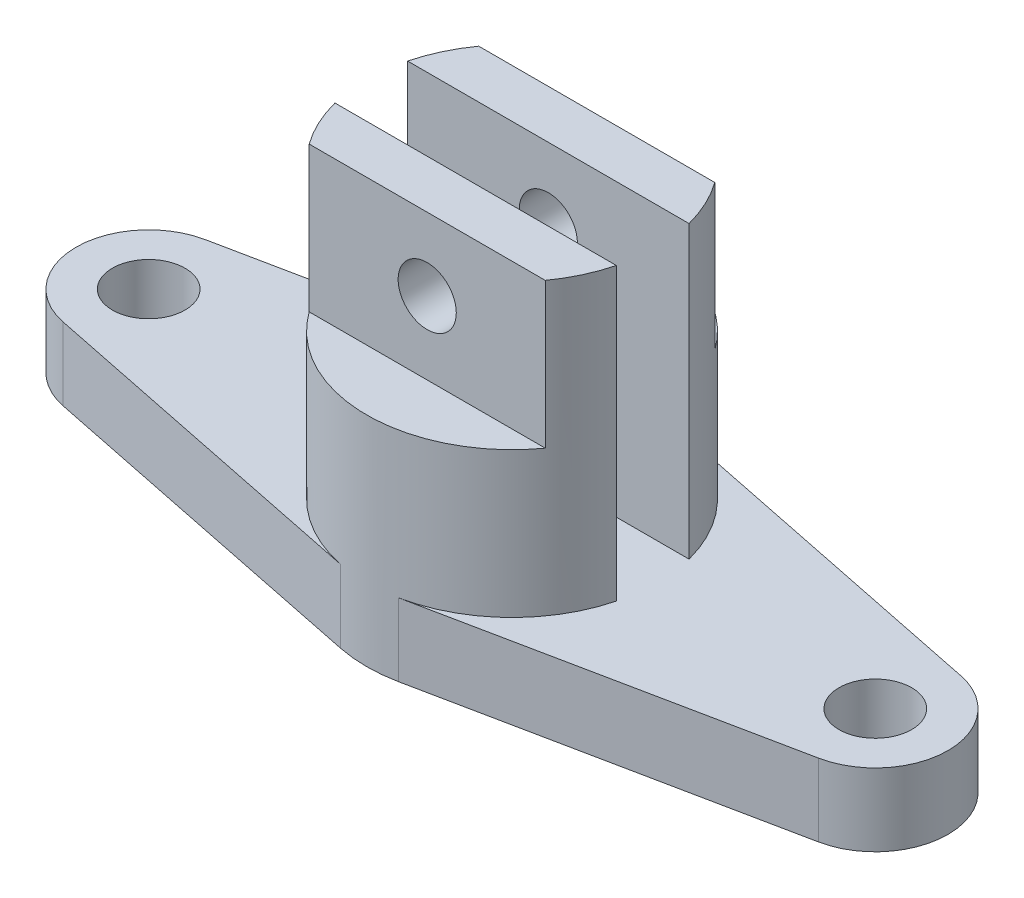
ISO-10303-21;
HEADER;
FILE_DESCRIPTION(('STEP AP214'),'2;1');
FILE_NAME('part.step','',(''),(''),'','','');
FILE_SCHEMA(('AUTOMOTIVE_DESIGN { 1 0 10303 214 1 1 1 1 }'));
ENDSEC;
DATA;
#1=APPLICATION_CONTEXT('core data for automotive mechanical design processes');
#2=APPLICATION_PROTOCOL_DEFINITION('international standard','automotive_design',2000,#1);
#3=PRODUCT_CONTEXT('',#1,'mechanical');
#4=PRODUCT('Part','Part','',(#3));
#5=PRODUCT_RELATED_PRODUCT_CATEGORY('part','',(#4));
#6=PRODUCT_DEFINITION_FORMATION('','',#4);
#7=PRODUCT_DEFINITION_CONTEXT('part definition',#1,'design');
#8=PRODUCT_DEFINITION('design','',#6,#7);
#9=PRODUCT_DEFINITION_SHAPE('','',#8);
#10=(LENGTH_UNIT() NAMED_UNIT(*) SI_UNIT(.MILLI.,.METRE.));
#11=(NAMED_UNIT(*) PLANE_ANGLE_UNIT() SI_UNIT($,.RADIAN.));
#12=(NAMED_UNIT(*) SI_UNIT($,.STERADIAN.) SOLID_ANGLE_UNIT());
#13=UNCERTAINTY_MEASURE_WITH_UNIT(LENGTH_MEASURE(1.E-05),#10,'distance_accuracy_value','');
#14=(GEOMETRIC_REPRESENTATION_CONTEXT(3) GLOBAL_UNCERTAINTY_ASSIGNED_CONTEXT((#13)) GLOBAL_UNIT_ASSIGNED_CONTEXT((#10,
#11,#12)) REPRESENTATION_CONTEXT('',''));
#15=CARTESIAN_POINT('',(0.,0.,0.));
#16=DIRECTION('',(0.,0.,1.));
#17=DIRECTION('',(1.,0.,0.));
#18=AXIS2_PLACEMENT_3D('',#15,#16,#17);
#19=CARTESIAN_POINT('',(0.,15.,0.));
#20=DIRECTION('',(0.,-1.,0.));
#21=DIRECTION('',(0.,0.,-1.));
#22=AXIS2_PLACEMENT_3D('',#19,#20,#21);
#23=CYLINDRICAL_SURFACE('',#22,30.);
#24=DIRECTION('',(0.,1.,0.));
#25=VECTOR('',#24,1.);
#26=CARTESIAN_POINT('',(-24.3669858620224,45.,17.5));
#27=LINE('',#26,#25);
#28=CARTESIAN_POINT('',(-24.3669858620224,45.,17.5));
#29=VERTEX_POINT('',#28);
#30=CARTESIAN_POINT('',(-24.3669858620224,75.,17.5));
#31=VERTEX_POINT('',#30);
#32=EDGE_CURVE('E212',#29,#31,#27,.T.);
#33=ORIENTED_EDGE('',*,*,#32,.T.);
#34=CARTESIAN_POINT('',(0.,75.,0.));
#35=DIRECTION('',(0.,1.,0.));
#36=DIRECTION('',(0.,0.,1.));
#37=AXIS2_PLACEMENT_3D('',#34,#35,#36);
#38=CIRCLE('',#37,30.);
#39=CARTESIAN_POINT('',(-29.0473750965556,75.,7.5));
#40=VERTEX_POINT('',#39);
#41=EDGE_CURVE('E222',#40,#31,#38,.T.);
#42=ORIENTED_EDGE('',*,*,#41,.F.);
#43=DIRECTION('',(0.,-1.,0.));
#44=VECTOR('',#43,1.);
#45=CARTESIAN_POINT('',(-29.0473750965556,75.,7.5));
#46=LINE('',#45,#44);
#47=CARTESIAN_POINT('',(-29.0473750965556,15.,7.5));
#48=VERTEX_POINT('',#47);
#49=EDGE_CURVE('E230',#40,#48,#46,.T.);
#50=ORIENTED_EDGE('',*,*,#49,.T.);
#51=CARTESIAN_POINT('',(0.,15.,0.));
#52=DIRECTION('',(0.,1.,0.));
#53=DIRECTION('',(0.,0.,1.));
#54=AXIS2_PLACEMENT_3D('',#51,#52,#53);
#55=CIRCLE('',#54,30.);
#56=CARTESIAN_POINT('',(-6.,15.,29.3938769133981));
#57=VERTEX_POINT('',#56);
#58=EDGE_CURVE('E55',#48,#57,#55,.T.);
#59=ORIENTED_EDGE('',*,*,#58,.T.);
#60=DIRECTION('',(0.,-1.,0.));
#61=VECTOR('',#60,1.);
#62=CARTESIAN_POINT('',(-6.00000000000005,15.,29.3938769133981));
#63=LINE('',#62,#61);
#64=CARTESIAN_POINT('',(-6.00000000000005,0.,29.3938769133981));
#65=VERTEX_POINT('',#64);
#66=EDGE_CURVE('E318',#57,#65,#63,.T.);
#67=ORIENTED_EDGE('',*,*,#66,.T.);
#68=CARTESIAN_POINT('',(0.,0.,0.));
#69=DIRECTION('',(0.,1.,0.));
#70=DIRECTION('',(0.,0.,1.));
#71=AXIS2_PLACEMENT_3D('',#68,#69,#70);
#72=CIRCLE('',#71,30.);
#73=CARTESIAN_POINT('',(6.00000000000005,0.,29.3938769133981));
#74=VERTEX_POINT('',#73);
#75=EDGE_CURVE('E292',#65,#74,#72,.T.);
#76=ORIENTED_EDGE('',*,*,#75,.T.);
#77=DIRECTION('',(0.,-1.,0.));
#78=VECTOR('',#77,1.);
#79=CARTESIAN_POINT('',(6.00000000000005,15.,29.3938769133981));
#80=LINE('',#79,#78);
#81=CARTESIAN_POINT('',(6.,15.,29.3938769133981));
#82=VERTEX_POINT('',#81);
#83=EDGE_CURVE('E314',#82,#74,#80,.T.);
#84=ORIENTED_EDGE('',*,*,#83,.F.);
#85=CARTESIAN_POINT('',(29.0473750965556,15.,7.5));
#86=VERTEX_POINT('',#85);
#87=EDGE_CURVE('E11',#82,#86,#55,.T.);
#88=ORIENTED_EDGE('',*,*,#87,.T.);
#89=DIRECTION('',(0.,-1.,0.));
#90=VECTOR('',#89,1.);
#91=CARTESIAN_POINT('',(29.0473750965556,75.,7.5));
#92=LINE('',#91,#90);
#93=CARTESIAN_POINT('',(29.0473750965556,75.,7.5));
#94=VERTEX_POINT('',#93);
#95=EDGE_CURVE('E239',#94,#86,#92,.T.);
#96=ORIENTED_EDGE('',*,*,#95,.F.);
#97=CARTESIAN_POINT('',(24.3669858620224,75.,17.5));
#98=VERTEX_POINT('',#97);
#99=EDGE_CURVE('E227',#98,#94,#38,.T.);
#100=ORIENTED_EDGE('',*,*,#99,.F.);
#101=DIRECTION('',(0.,1.,0.));
#102=VECTOR('',#101,1.);
#103=CARTESIAN_POINT('',(24.3669858620224,45.,17.5));
#104=LINE('',#103,#102);
#105=CARTESIAN_POINT('',(24.3669858620224,45.,17.5));
#106=VERTEX_POINT('',#105);
#107=EDGE_CURVE('E219',#106,#98,#104,.T.);
#108=ORIENTED_EDGE('',*,*,#107,.F.);
#109=CARTESIAN_POINT('',(0.,45.,0.));
#110=DIRECTION('',(0.,1.,0.));
#111=DIRECTION('',(0.,0.,1.));
#112=AXIS2_PLACEMENT_3D('',#109,#110,#111);
#113=CIRCLE('',#112,30.);
#114=EDGE_CURVE('E208',#29,#106,#113,.T.);
#115=ORIENTED_EDGE('',*,*,#114,.F.);
#116=EDGE_LOOP('',(#33,#42,#50,#59,#67,#76,#84,#88,#96,#100,#108,#115));
#117=FACE_BOUND('',#116,.T.);
#118=ADVANCED_FACE('F43',(#117),#23,.T.);
#119=CARTESIAN_POINT('',(0.,75.,0.));
#120=DIRECTION('',(0.,1.,0.));
#121=DIRECTION('',(0.,0.,1.));
#122=AXIS2_PLACEMENT_3D('',#119,#120,#121);
#123=PLANE('',#122);
#124=ORIENTED_EDGE('',*,*,#41,.T.);
#125=DIRECTION('',(1.,0.,0.));
#126=VECTOR('',#125,1.);
#127=CARTESIAN_POINT('',(-24.3669858620224,75.,17.5));
#128=LINE('',#127,#126);
#129=EDGE_CURVE('E204',#31,#98,#128,.T.);
#130=ORIENTED_EDGE('',*,*,#129,.T.);
#131=ORIENTED_EDGE('',*,*,#99,.T.);
#132=DIRECTION('',(1.,0.,0.));
#133=VECTOR('',#132,1.);
#134=CARTESIAN_POINT('',(-29.0473750965556,75.,7.5));
#135=LINE('',#134,#133);
#136=EDGE_CURVE('E226',#40,#94,#135,.T.);
#137=ORIENTED_EDGE('',*,*,#136,.F.);
#138=EDGE_LOOP('',(#124,#130,#131,#137));
#139=FACE_BOUND('',#138,.T.);
#140=ADVANCED_FACE('F397',(#139),#123,.T.);
#141=CARTESIAN_POINT('',(0.,15.,0.));
#142=DIRECTION('',(0.,1.,0.));
#143=DIRECTION('',(0.,0.,1.));
#144=AXIS2_PLACEMENT_3D('',#141,#142,#143);
#145=PLANE('',#144);
#146=CARTESIAN_POINT('',(0.,15.,0.));
#147=DIRECTION('',(0.,-1.,0.));
#148=DIRECTION('',(0.,0.,-1.));
#149=AXIS2_PLACEMENT_3D('',#146,#147,#148);
#150=CIRCLE('',#149,30.);
#151=CARTESIAN_POINT('',(6.,15.,-29.3938769133981));
#152=VERTEX_POINT('',#151);
#153=CARTESIAN_POINT('',(29.0473750965556,15.,-7.5));
#154=VERTEX_POINT('',#153);
#155=EDGE_CURVE('E178',#152,#154,#150,.T.);
#156=ORIENTED_EDGE('',*,*,#155,.T.);
#157=DIRECTION('',(1.,0.,0.));
#158=VECTOR('',#157,1.);
#159=CARTESIAN_POINT('',(-29.0473750965556,15.,-7.5));
#160=LINE('',#159,#158);
#161=CARTESIAN_POINT('',(-29.0473750965556,15.,-7.5));
#162=VERTEX_POINT('',#161);
#163=EDGE_CURVE('E70',#162,#154,#160,.T.);
#164=ORIENTED_EDGE('',*,*,#163,.F.);
#165=CARTESIAN_POINT('',(-5.99999999999999,15.,-29.3938769133981));
#166=VERTEX_POINT('',#165);
#167=EDGE_CURVE('E182',#162,#166,#150,.T.);
#168=ORIENTED_EDGE('',*,*,#167,.T.);
#169=DIRECTION('',(-0.979795897113271,0.,0.2));
#170=VECTOR('',#169,1.);
#171=CARTESIAN_POINT('',(-6.,15.,-29.3938769133981));
#172=LINE('',#171,#170);
#173=CARTESIAN_POINT('',(-78.,15.,-14.6969384566991));
#174=VERTEX_POINT('',#173);
#175=EDGE_CURVE('E259',#166,#174,#172,.T.);
#176=ORIENTED_EDGE('',*,*,#175,.T.);
#177=CARTESIAN_POINT('',(-75.,15.,0.));
#178=DIRECTION('',(0.,1.,0.));
#179=DIRECTION('',(0.,0.,1.));
#180=AXIS2_PLACEMENT_3D('',#177,#178,#179);
#181=CIRCLE('',#180,15.);
#182=CARTESIAN_POINT('',(-78.,15.,14.6969384566991));
#183=VERTEX_POINT('',#182);
#184=EDGE_CURVE('E262',#174,#183,#181,.T.);
#185=ORIENTED_EDGE('',*,*,#184,.T.);
#186=DIRECTION('',(0.979795897113271,0.,0.2));
#187=VECTOR('',#186,1.);
#188=CARTESIAN_POINT('',(-6.00000000000005,15.,29.3938769133981));
#189=LINE('',#188,#187);
#190=EDGE_CURVE('E266',#183,#57,#189,.T.);
#191=ORIENTED_EDGE('',*,*,#190,.T.);
#192=ORIENTED_EDGE('',*,*,#58,.F.);
#193=DIRECTION('',(1.,0.,0.));
#194=VECTOR('',#193,1.);
#195=CARTESIAN_POINT('',(-29.0473750965556,15.,7.5));
#196=LINE('',#195,#194);
#197=EDGE_CURVE('E233',#48,#86,#196,.T.);
#198=ORIENTED_EDGE('',*,*,#197,.T.);
#199=ORIENTED_EDGE('',*,*,#87,.F.);
#200=DIRECTION('',(0.979795897113271,0.,-0.2));
#201=VECTOR('',#200,1.);
#202=CARTESIAN_POINT('',(6.00000000000005,15.,29.3938769133981));
#203=LINE('',#202,#201);
#204=CARTESIAN_POINT('',(78.,15.,14.696938456699));
#205=VERTEX_POINT('',#204);
#206=EDGE_CURVE('E270',#82,#205,#203,.T.);
#207=ORIENTED_EDGE('',*,*,#206,.T.);
#208=CARTESIAN_POINT('',(75.,15.,0.));
#209=DIRECTION('',(0.,1.,0.));
#210=DIRECTION('',(0.,0.,-1.));
#211=AXIS2_PLACEMENT_3D('',#208,#209,#210);
#212=CIRCLE('',#211,15.);
#213=CARTESIAN_POINT('',(78.,15.,-14.6969384566991));
#214=VERTEX_POINT('',#213);
#215=EDGE_CURVE('E273',#205,#214,#212,.T.);
#216=ORIENTED_EDGE('',*,*,#215,.T.);
#217=DIRECTION('',(-0.979795897113271,0.,-0.2));
#218=VECTOR('',#217,1.);
#219=CARTESIAN_POINT('',(6.,15.,-29.3938769133981));
#220=LINE('',#219,#218);
#221=EDGE_CURVE('E276',#214,#152,#220,.T.);
#222=ORIENTED_EDGE('',*,*,#221,.T.);
#223=EDGE_LOOP('',(#156,#164,#168,#176,#185,#191,#192,#198,#199,#207,#216,#222));
#224=FACE_BOUND('',#223,.T.);
#225=CARTESIAN_POINT('',(-75.,15.,0.));
#226=DIRECTION('',(0.,1.,0.));
#227=DIRECTION('',(0.,0.,1.));
#228=AXIS2_PLACEMENT_3D('',#225,#226,#227);
#229=CIRCLE('',#228,7.5);
#230=CARTESIAN_POINT('',(-75.,15.,7.5));
#231=VERTEX_POINT('',#230);
#232=EDGE_CURVE('E251',#231,#231,#229,.T.);
#233=ORIENTED_EDGE('',*,*,#232,.F.);
#234=EDGE_LOOP('',(#233));
#235=FACE_BOUND('',#234,.T.);
#236=CARTESIAN_POINT('',(75.,15.,0.));
#237=DIRECTION('',(0.,1.,0.));
#238=DIRECTION('',(0.,0.,-1.));
#239=AXIS2_PLACEMENT_3D('',#236,#237,#238);
#240=CIRCLE('',#239,7.5);
#241=CARTESIAN_POINT('',(75.,15.,-7.50000000000003));
#242=VERTEX_POINT('',#241);
#243=EDGE_CURVE('E243',#242,#242,#240,.T.);
#244=ORIENTED_EDGE('',*,*,#243,.F.);
#245=EDGE_LOOP('',(#244));
#246=FACE_BOUND('',#245,.T.);
#247=ADVANCED_FACE('F356',(#224,#235,#246),#145,.T.);
#248=CARTESIAN_POINT('',(0.,0.,0.));
#249=DIRECTION('',(0.,1.,0.));
#250=DIRECTION('',(0.,0.,1.));
#251=AXIS2_PLACEMENT_3D('',#248,#249,#250);
#252=PLANE('',#251);
#253=CARTESIAN_POINT('',(0.,0.,0.));
#254=DIRECTION('',(0.,1.,0.));
#255=DIRECTION('',(0.,0.,1.));
#256=AXIS2_PLACEMENT_3D('',#253,#254,#255);
#257=CIRCLE('',#256,30.);
#258=CARTESIAN_POINT('',(6.,0.,-29.3938769133981));
#259=VERTEX_POINT('',#258);
#260=CARTESIAN_POINT('',(-6.,0.,-29.3938769133981));
#261=VERTEX_POINT('',#260);
#262=EDGE_CURVE('E255',#259,#261,#257,.T.);
#263=ORIENTED_EDGE('',*,*,#262,.F.);
#264=DIRECTION('',(-0.979795897113271,0.,-0.2));
#265=VECTOR('',#264,1.);
#266=CARTESIAN_POINT('',(6.,0.,-29.3938769133981));
#267=LINE('',#266,#265);
#268=CARTESIAN_POINT('',(78.,0.,-14.6969384566991));
#269=VERTEX_POINT('',#268);
#270=EDGE_CURVE('E263',#269,#259,#267,.T.);
#271=ORIENTED_EDGE('',*,*,#270,.F.);
#272=CARTESIAN_POINT('',(75.,0.,0.));
#273=DIRECTION('',(0.,1.,0.));
#274=DIRECTION('',(0.,0.,-1.));
#275=AXIS2_PLACEMENT_3D('',#272,#273,#274);
#276=CIRCLE('',#275,15.);
#277=CARTESIAN_POINT('',(78.,0.,14.696938456699));
#278=VERTEX_POINT('',#277);
#279=EDGE_CURVE('E298',#278,#269,#276,.T.);
#280=ORIENTED_EDGE('',*,*,#279,.F.);
#281=DIRECTION('',(0.979795897113271,0.,-0.2));
#282=VECTOR('',#281,1.);
#283=CARTESIAN_POINT('',(6.00000000000005,0.,29.3938769133981));
#284=LINE('',#283,#282);
#285=EDGE_CURVE('E295',#74,#278,#284,.T.);
#286=ORIENTED_EDGE('',*,*,#285,.F.);
#287=ORIENTED_EDGE('',*,*,#75,.F.);
#288=DIRECTION('',(0.979795897113271,0.,0.2));
#289=VECTOR('',#288,1.);
#290=CARTESIAN_POINT('',(-6.00000000000005,0.,29.3938769133981));
#291=LINE('',#290,#289);
#292=CARTESIAN_POINT('',(-78.,0.,14.6969384566991));
#293=VERTEX_POINT('',#292);
#294=EDGE_CURVE('E289',#293,#65,#291,.T.);
#295=ORIENTED_EDGE('',*,*,#294,.F.);
#296=CARTESIAN_POINT('',(-75.,0.,0.));
#297=DIRECTION('',(0.,1.,0.));
#298=DIRECTION('',(0.,0.,1.));
#299=AXIS2_PLACEMENT_3D('',#296,#297,#298);
#300=CIRCLE('',#299,15.);
#301=CARTESIAN_POINT('',(-78.,0.,-14.6969384566991));
#302=VERTEX_POINT('',#301);
#303=EDGE_CURVE('E286',#302,#293,#300,.T.);
#304=ORIENTED_EDGE('',*,*,#303,.F.);
#305=DIRECTION('',(-0.979795897113271,0.,0.2));
#306=VECTOR('',#305,1.);
#307=CARTESIAN_POINT('',(-6.,0.,-29.3938769133981));
#308=LINE('',#307,#306);
#309=EDGE_CURVE('E283',#261,#302,#308,.T.);
#310=ORIENTED_EDGE('',*,*,#309,.F.);
#311=EDGE_LOOP('',(#263,#271,#280,#286,#287,#295,#304,#310));
#312=FACE_BOUND('',#311,.T.);
#313=CARTESIAN_POINT('',(-75.,0.,0.));
#314=DIRECTION('',(0.,1.,0.));
#315=DIRECTION('',(0.,0.,1.));
#316=AXIS2_PLACEMENT_3D('',#313,#314,#315);
#317=CIRCLE('',#316,7.5);
#318=CARTESIAN_POINT('',(-75.,0.,7.5));
#319=VERTEX_POINT('',#318);
#320=EDGE_CURVE('E247',#319,#319,#317,.T.);
#321=ORIENTED_EDGE('',*,*,#320,.T.);
#322=EDGE_LOOP('',(#321));
#323=FACE_BOUND('',#322,.T.);
#324=CARTESIAN_POINT('',(75.,0.,0.));
#325=DIRECTION('',(0.,1.,0.));
#326=DIRECTION('',(0.,0.,-1.));
#327=AXIS2_PLACEMENT_3D('',#324,#325,#326);
#328=CIRCLE('',#327,7.5);
#329=CARTESIAN_POINT('',(75.,0.,-7.50000000000003));
#330=VERTEX_POINT('',#329);
#331=EDGE_CURVE('E242',#330,#330,#328,.T.);
#332=ORIENTED_EDGE('',*,*,#331,.T.);
#333=EDGE_LOOP('',(#332));
#334=FACE_BOUND('',#333,.T.);
#335=ADVANCED_FACE('F341',(#312,#323,#334),#252,.F.);
#336=CARTESIAN_POINT('',(0.,15.,0.));
#337=DIRECTION('',(0.,-1.,0.));
#338=DIRECTION('',(0.,0.,-1.));
#339=AXIS2_PLACEMENT_3D('',#336,#337,#338);
#340=CYLINDRICAL_SURFACE('',#339,30.);
#341=CARTESIAN_POINT('',(0.,75.,0.));
#342=DIRECTION('',(0.,-1.,0.));
#343=DIRECTION('',(0.,0.,-1.));
#344=AXIS2_PLACEMENT_3D('',#341,#342,#343);
#345=CIRCLE('',#344,30.);
#346=CARTESIAN_POINT('',(-29.0473750965556,75.,-7.5));
#347=VERTEX_POINT('',#346);
#348=CARTESIAN_POINT('',(-24.3669858620224,75.,-17.5));
#349=VERTEX_POINT('',#348);
#350=EDGE_CURVE('E176',#347,#349,#345,.T.);
#351=ORIENTED_EDGE('',*,*,#350,.T.);
#352=DIRECTION('',(0.,1.,0.));
#353=VECTOR('',#352,1.);
#354=CARTESIAN_POINT('',(-24.3669858620224,45.,-17.5));
#355=LINE('',#354,#353);
#356=CARTESIAN_POINT('',(-24.3669858620224,45.,-17.5));
#357=VERTEX_POINT('',#356);
#358=EDGE_CURVE('E62',#357,#349,#355,.T.);
#359=ORIENTED_EDGE('',*,*,#358,.F.);
#360=CARTESIAN_POINT('',(0.,45.,0.));
#361=DIRECTION('',(0.,-1.,0.));
#362=DIRECTION('',(0.,0.,-1.));
#363=AXIS2_PLACEMENT_3D('',#360,#361,#362);
#364=CIRCLE('',#363,30.);
#365=CARTESIAN_POINT('',(24.3669858620224,45.,-17.5));
#366=VERTEX_POINT('',#365);
#367=EDGE_CURVE('E162',#357,#366,#364,.T.);
#368=ORIENTED_EDGE('',*,*,#367,.T.);
#369=DIRECTION('',(0.,1.,0.));
#370=VECTOR('',#369,1.);
#371=CARTESIAN_POINT('',(24.3669858620224,45.,-17.5));
#372=LINE('',#371,#370);
#373=CARTESIAN_POINT('',(24.3669858620224,75.,-17.5));
#374=VERTEX_POINT('',#373);
#375=EDGE_CURVE('E168',#366,#374,#372,.T.);
#376=ORIENTED_EDGE('',*,*,#375,.T.);
#377=CARTESIAN_POINT('',(29.0473750965556,75.,-7.5));
#378=VERTEX_POINT('',#377);
#379=EDGE_CURVE('E190',#374,#378,#345,.T.);
#380=ORIENTED_EDGE('',*,*,#379,.T.);
#381=DIRECTION('',(0.,-1.,0.));
#382=VECTOR('',#381,1.);
#383=CARTESIAN_POINT('',(29.0473750965556,75.,-7.5));
#384=LINE('',#383,#382);
#385=EDGE_CURVE('E193',#378,#154,#384,.T.);
#386=ORIENTED_EDGE('',*,*,#385,.T.);
#387=ORIENTED_EDGE('',*,*,#155,.F.);
#388=DIRECTION('',(0.,-1.,0.));
#389=VECTOR('',#388,1.);
#390=CARTESIAN_POINT('',(6.,15.,-29.3938769133981));
#391=LINE('',#390,#389);
#392=EDGE_CURVE('E279',#152,#259,#391,.T.);
#393=ORIENTED_EDGE('',*,*,#392,.T.);
#394=ORIENTED_EDGE('',*,*,#262,.T.);
#395=DIRECTION('',(0.,-1.,0.));
#396=VECTOR('',#395,1.);
#397=CARTESIAN_POINT('',(-6.,15.,-29.3938769133981));
#398=LINE('',#397,#396);
#399=EDGE_CURVE('E53',#166,#261,#398,.T.);
#400=ORIENTED_EDGE('',*,*,#399,.F.);
#401=ORIENTED_EDGE('',*,*,#167,.F.);
#402=DIRECTION('',(0.,-1.,0.));
#403=VECTOR('',#402,1.);
#404=CARTESIAN_POINT('',(-29.0473750965556,75.,-7.5));
#405=LINE('',#404,#403);
#406=EDGE_CURVE('E201',#347,#162,#405,.T.);
#407=ORIENTED_EDGE('',*,*,#406,.F.);
#408=EDGE_LOOP('',(#351,#359,#368,#376,#380,#386,#387,#393,#394,#400,#401,#407));
#409=FACE_BOUND('',#408,.T.);
#410=ADVANCED_FACE('F45',(#409),#340,.T.);
#411=CARTESIAN_POINT('',(-6.,15.,-29.3938769133981));
#412=DIRECTION('',(0.2,0.,0.979795897113271));
#413=DIRECTION('',(0.979795897113271,0.,-0.2));
#414=AXIS2_PLACEMENT_3D('',#411,#412,#413);
#415=PLANE('',#414);
#416=ORIENTED_EDGE('',*,*,#309,.T.);
#417=DIRECTION('',(0.,-1.,0.));
#418=VECTOR('',#417,1.);
#419=CARTESIAN_POINT('',(-78.,15.,-14.6969384566991));
#420=LINE('',#419,#418);
#421=EDGE_CURVE('E326',#174,#302,#420,.T.);
#422=ORIENTED_EDGE('',*,*,#421,.F.);
#423=ORIENTED_EDGE('',*,*,#175,.F.);
#424=ORIENTED_EDGE('',*,*,#399,.T.);
#425=EDGE_LOOP('',(#416,#422,#423,#424));
#426=FACE_BOUND('',#425,.T.);
#427=ADVANCED_FACE('F333',(#426),#415,.F.);
#428=CARTESIAN_POINT('',(-75.,15.,0.));
#429=DIRECTION('',(0.,-1.,0.));
#430=DIRECTION('',(0.,0.,-1.));
#431=AXIS2_PLACEMENT_3D('',#428,#429,#430);
#432=CYLINDRICAL_SURFACE('',#431,15.);
#433=ORIENTED_EDGE('',*,*,#303,.T.);
#434=DIRECTION('',(0.,-1.,0.));
#435=VECTOR('',#434,1.);
#436=CARTESIAN_POINT('',(-78.,15.,14.6969384566991));
#437=LINE('',#436,#435);
#438=EDGE_CURVE('E322',#183,#293,#437,.T.);
#439=ORIENTED_EDGE('',*,*,#438,.F.);
#440=ORIENTED_EDGE('',*,*,#184,.F.);
#441=ORIENTED_EDGE('',*,*,#421,.T.);
#442=EDGE_LOOP('',(#433,#439,#440,#441));
#443=FACE_BOUND('',#442,.T.);
#444=ADVANCED_FACE('F349',(#443),#432,.T.);
#445=CARTESIAN_POINT('',(-6.00000000000005,15.,29.3938769133981));
#446=DIRECTION('',(0.2,0.,-0.979795897113271));
#447=DIRECTION('',(-0.979795897113271,0.,-0.2));
#448=AXIS2_PLACEMENT_3D('',#445,#446,#447);
#449=PLANE('',#448);
#450=ORIENTED_EDGE('',*,*,#294,.T.);
#451=ORIENTED_EDGE('',*,*,#66,.F.);
#452=ORIENTED_EDGE('',*,*,#190,.F.);
#453=ORIENTED_EDGE('',*,*,#438,.T.);
#454=EDGE_LOOP('',(#450,#451,#452,#453));
#455=FACE_BOUND('',#454,.T.);
#456=ADVANCED_FACE('F353',(#455),#449,.F.);
#457=CARTESIAN_POINT('',(6.00000000000005,15.,29.3938769133981));
#458=DIRECTION('',(-0.2,0.,-0.979795897113271));
#459=DIRECTION('',(-0.979795897113271,0.,0.2));
#460=AXIS2_PLACEMENT_3D('',#457,#458,#459);
#461=PLANE('',#460);
#462=ORIENTED_EDGE('',*,*,#285,.T.);
#463=DIRECTION('',(0.,-1.,0.));
#464=VECTOR('',#463,1.);
#465=CARTESIAN_POINT('',(78.,15.,14.696938456699));
#466=LINE('',#465,#464);
#467=EDGE_CURVE('E310',#205,#278,#466,.T.);
#468=ORIENTED_EDGE('',*,*,#467,.F.);
#469=ORIENTED_EDGE('',*,*,#206,.F.);
#470=ORIENTED_EDGE('',*,*,#83,.T.);
#471=EDGE_LOOP('',(#462,#468,#469,#470));
#472=FACE_BOUND('',#471,.T.);
#473=ADVANCED_FACE('F407',(#472),#461,.F.);
#474=CARTESIAN_POINT('',(75.,15.,0.));
#475=DIRECTION('',(0.,-1.,0.));
#476=DIRECTION('',(0.,0.,-1.));
#477=AXIS2_PLACEMENT_3D('',#474,#475,#476);
#478=CYLINDRICAL_SURFACE('',#477,15.);
#479=ORIENTED_EDGE('',*,*,#279,.T.);
#480=DIRECTION('',(0.,-1.,0.));
#481=VECTOR('',#480,1.);
#482=CARTESIAN_POINT('',(78.,15.,-14.6969384566991));
#483=LINE('',#482,#481);
#484=EDGE_CURVE('E306',#214,#269,#483,.T.);
#485=ORIENTED_EDGE('',*,*,#484,.F.);
#486=ORIENTED_EDGE('',*,*,#215,.F.);
#487=ORIENTED_EDGE('',*,*,#467,.T.);
#488=EDGE_LOOP('',(#479,#485,#486,#487));
#489=FACE_BOUND('',#488,.T.);
#490=ADVANCED_FACE('F429',(#489),#478,.T.);
#491=CARTESIAN_POINT('',(6.,15.,-29.3938769133981));
#492=DIRECTION('',(-0.2,0.,0.979795897113271));
#493=DIRECTION('',(0.979795897113271,0.,0.2));
#494=AXIS2_PLACEMENT_3D('',#491,#492,#493);
#495=PLANE('',#494);
#496=ORIENTED_EDGE('',*,*,#270,.T.);
#497=ORIENTED_EDGE('',*,*,#392,.F.);
#498=ORIENTED_EDGE('',*,*,#221,.F.);
#499=ORIENTED_EDGE('',*,*,#484,.T.);
#500=EDGE_LOOP('',(#496,#497,#498,#499));
#501=FACE_BOUND('',#500,.T.);
#502=ADVANCED_FACE('F426',(#501),#495,.F.);
#503=CARTESIAN_POINT('',(-75.,15.,0.));
#504=DIRECTION('',(0.,-1.,0.));
#505=DIRECTION('',(0.,0.,-1.));
#506=AXIS2_PLACEMENT_3D('',#503,#504,#505);
#507=CYLINDRICAL_SURFACE('',#506,7.5);
#508=ORIENTED_EDGE('',*,*,#232,.T.);
#509=EDGE_LOOP('',(#508));
#510=FACE_BOUND('',#509,.T.);
#511=ORIENTED_EDGE('',*,*,#320,.F.);
#512=EDGE_LOOP('',(#511));
#513=FACE_BOUND('',#512,.T.);
#514=ADVANCED_FACE('F428',(#510,#513),#507,.F.);
#515=CARTESIAN_POINT('',(75.,15.,0.));
#516=DIRECTION('',(0.,-1.,0.));
#517=DIRECTION('',(0.,0.,-1.));
#518=AXIS2_PLACEMENT_3D('',#515,#516,#517);
#519=CYLINDRICAL_SURFACE('',#518,7.5);
#520=ORIENTED_EDGE('',*,*,#243,.T.);
#521=EDGE_LOOP('',(#520));
#522=FACE_BOUND('',#521,.T.);
#523=ORIENTED_EDGE('',*,*,#331,.F.);
#524=EDGE_LOOP('',(#523));
#525=FACE_BOUND('',#524,.T.);
#526=ADVANCED_FACE('F473',(#522,#525),#519,.F.);
#527=CARTESIAN_POINT('',(-29.0473750965556,75.,7.5));
#528=DIRECTION('',(0.,0.,-1.));
#529=DIRECTION('',(-1.,0.,0.));
#530=AXIS2_PLACEMENT_3D('',#527,#528,#529);
#531=PLANE('',#530);
#532=CARTESIAN_POINT('',(0.,60.,7.49999999999999));
#533=DIRECTION('',(0.,0.,-1.));
#534=DIRECTION('',(-1.,0.,0.));
#535=AXIS2_PLACEMENT_3D('',#532,#533,#534);
#536=CIRCLE('',#535,6.);
#537=CARTESIAN_POINT('',(6.,60.,7.49999999999999));
#538=VERTEX_POINT('',#537);
#539=EDGE_CURVE('E366',#538,#538,#536,.T.);
#540=ORIENTED_EDGE('',*,*,#539,.F.);
#541=EDGE_LOOP('',(#540));
#542=FACE_BOUND('',#541,.T.);
#543=ORIENTED_EDGE('',*,*,#197,.F.);
#544=ORIENTED_EDGE('',*,*,#49,.F.);
#545=ORIENTED_EDGE('',*,*,#136,.T.);
#546=ORIENTED_EDGE('',*,*,#95,.T.);
#547=EDGE_LOOP('',(#543,#544,#545,#546));
#548=FACE_BOUND('',#547,.T.);
#549=ADVANCED_FACE('F448',(#542,#548),#531,.T.);
#550=CARTESIAN_POINT('',(-24.3669858620224,45.,17.5));
#551=DIRECTION('',(0.,0.,1.));
#552=DIRECTION('',(1.,0.,0.));
#553=AXIS2_PLACEMENT_3D('',#550,#551,#552);
#554=PLANE('',#553);
#555=CARTESIAN_POINT('',(0.,60.,17.5));
#556=DIRECTION('',(0.,0.,1.));
#557=DIRECTION('',(1.,0.,0.));
#558=AXIS2_PLACEMENT_3D('',#555,#556,#557);
#559=CIRCLE('',#558,6.);
#560=CARTESIAN_POINT('',(6.,60.,17.5));
#561=VERTEX_POINT('',#560);
#562=EDGE_CURVE('E369',#561,#561,#559,.T.);
#563=ORIENTED_EDGE('',*,*,#562,.F.);
#564=EDGE_LOOP('',(#563));
#565=FACE_BOUND('',#564,.T.);
#566=ORIENTED_EDGE('',*,*,#129,.F.);
#567=ORIENTED_EDGE('',*,*,#32,.F.);
#568=DIRECTION('',(1.,0.,0.));
#569=VECTOR('',#568,1.);
#570=CARTESIAN_POINT('',(-24.3669858620224,45.,17.5));
#571=LINE('',#570,#569);
#572=EDGE_CURVE('E205',#29,#106,#571,.T.);
#573=ORIENTED_EDGE('',*,*,#572,.T.);
#574=ORIENTED_EDGE('',*,*,#107,.T.);
#575=EDGE_LOOP('',(#566,#567,#573,#574));
#576=FACE_BOUND('',#575,.T.);
#577=ADVANCED_FACE('F456',(#565,#576),#554,.T.);
#578=CARTESIAN_POINT('',(0.,45.,0.));
#579=DIRECTION('',(0.,1.,0.));
#580=DIRECTION('',(0.,0.,1.));
#581=AXIS2_PLACEMENT_3D('',#578,#579,#580);
#582=PLANE('',#581);
#583=ORIENTED_EDGE('',*,*,#572,.F.);
#584=ORIENTED_EDGE('',*,*,#114,.T.);
#585=EDGE_LOOP('',(#583,#584));
#586=FACE_BOUND('',#585,.T.);
#587=ADVANCED_FACE('F459',(#586),#582,.T.);
#588=CARTESIAN_POINT('',(-29.0473750965556,75.,-7.5));
#589=DIRECTION('',(0.,0.,-1.));
#590=DIRECTION('',(-1.,0.,0.));
#591=AXIS2_PLACEMENT_3D('',#588,#589,#590);
#592=PLANE('',#591);
#593=CARTESIAN_POINT('',(0.,60.,-7.5));
#594=DIRECTION('',(0.,0.,-1.));
#595=DIRECTION('',(-1.,0.,0.));
#596=AXIS2_PLACEMENT_3D('',#593,#594,#595);
#597=CIRCLE('',#596,6.);
#598=CARTESIAN_POINT('',(6.,60.,-7.5));
#599=VERTEX_POINT('',#598);
#600=EDGE_CURVE('E375',#599,#599,#597,.T.);
#601=ORIENTED_EDGE('',*,*,#600,.T.);
#602=EDGE_LOOP('',(#601));
#603=FACE_BOUND('',#602,.T.);
#604=ORIENTED_EDGE('',*,*,#163,.T.);
#605=ORIENTED_EDGE('',*,*,#385,.F.);
#606=DIRECTION('',(1.,0.,0.));
#607=VECTOR('',#606,1.);
#608=CARTESIAN_POINT('',(-29.0473750965556,75.,-7.5));
#609=LINE('',#608,#607);
#610=EDGE_CURVE('E189',#347,#378,#609,.T.);
#611=ORIENTED_EDGE('',*,*,#610,.F.);
#612=ORIENTED_EDGE('',*,*,#406,.T.);
#613=EDGE_LOOP('',(#604,#605,#611,#612));
#614=FACE_BOUND('',#613,.T.);
#615=ADVANCED_FACE('F361',(#603,#614),#592,.F.);
#616=CARTESIAN_POINT('',(0.,75.,0.));
#617=DIRECTION('',(0.,1.,0.));
#618=DIRECTION('',(0.,0.,-1.));
#619=AXIS2_PLACEMENT_3D('',#616,#617,#618);
#620=PLANE('',#619);
#621=DIRECTION('',(1.,0.,0.));
#622=VECTOR('',#621,1.);
#623=CARTESIAN_POINT('',(-24.3669858620224,75.,-17.5));
#624=LINE('',#623,#622);
#625=EDGE_CURVE('E172',#349,#374,#624,.T.);
#626=ORIENTED_EDGE('',*,*,#625,.F.);
#627=ORIENTED_EDGE('',*,*,#350,.F.);
#628=ORIENTED_EDGE('',*,*,#610,.T.);
#629=ORIENTED_EDGE('',*,*,#379,.F.);
#630=EDGE_LOOP('',(#626,#627,#628,#629));
#631=FACE_BOUND('',#630,.T.);
#632=ADVANCED_FACE('F364',(#631),#620,.T.);
#633=CARTESIAN_POINT('',(-24.3669858620224,45.,-17.5));
#634=DIRECTION('',(0.,0.,1.));
#635=DIRECTION('',(1.,0.,0.));
#636=AXIS2_PLACEMENT_3D('',#633,#634,#635);
#637=PLANE('',#636);
#638=CARTESIAN_POINT('',(0.,60.,-17.5));
#639=DIRECTION('',(0.,0.,1.));
#640=DIRECTION('',(1.,0.,0.));
#641=AXIS2_PLACEMENT_3D('',#638,#639,#640);
#642=CIRCLE('',#641,6.);
#643=CARTESIAN_POINT('',(6.,60.,-17.5));
#644=VERTEX_POINT('',#643);
#645=EDGE_CURVE('E47',#644,#644,#642,.T.);
#646=ORIENTED_EDGE('',*,*,#645,.T.);
#647=EDGE_LOOP('',(#646));
#648=FACE_BOUND('',#647,.T.);
#649=ORIENTED_EDGE('',*,*,#625,.T.);
#650=ORIENTED_EDGE('',*,*,#375,.F.);
#651=DIRECTION('',(1.,0.,0.));
#652=VECTOR('',#651,1.);
#653=CARTESIAN_POINT('',(-24.3669858620224,45.,-17.5));
#654=LINE('',#653,#652);
#655=EDGE_CURVE('E164',#357,#366,#654,.T.);
#656=ORIENTED_EDGE('',*,*,#655,.F.);
#657=ORIENTED_EDGE('',*,*,#358,.T.);
#658=EDGE_LOOP('',(#649,#650,#656,#657));
#659=FACE_BOUND('',#658,.T.);
#660=ADVANCED_FACE('F170',(#648,#659),#637,.F.);
#661=CARTESIAN_POINT('',(0.,45.,0.));
#662=DIRECTION('',(0.,1.,0.));
#663=DIRECTION('',(0.,0.,-1.));
#664=AXIS2_PLACEMENT_3D('',#661,#662,#663);
#665=PLANE('',#664);
#666=ORIENTED_EDGE('',*,*,#655,.T.);
#667=ORIENTED_EDGE('',*,*,#367,.F.);
#668=EDGE_LOOP('',(#666,#667));
#669=FACE_BOUND('',#668,.T.);
#670=ADVANCED_FACE('F163',(#669),#665,.T.);
#671=CARTESIAN_POINT('',(0.,60.,-30.));
#672=DIRECTION('',(0.,0.,1.));
#673=DIRECTION('',(1.,0.,0.));
#674=AXIS2_PLACEMENT_3D('',#671,#672,#673);
#675=CYLINDRICAL_SURFACE('',#674,6.);
#676=CARTESIAN_POINT('',(6.,60.,-17.5));
#677=CARTESIAN_POINT('',(6.,60.,-17.3958333333333));
#678=CARTESIAN_POINT('',(6.,60.,-17.2916666666667));
#679=CARTESIAN_POINT('',(6.,60.,-17.0833333333333));
#680=CARTESIAN_POINT('',(6.,60.,-16.9791666666667));
#681=CARTESIAN_POINT('',(6.,60.,-16.7708333333333));
#682=CARTESIAN_POINT('',(6.,60.,-16.6666666666667));
#683=CARTESIAN_POINT('',(6.,60.,-16.4583333333333));
#684=CARTESIAN_POINT('',(6.,60.,-16.3541666666667));
#685=CARTESIAN_POINT('',(6.,60.,-16.1458333333333));
#686=CARTESIAN_POINT('',(6.,60.,-16.0416666666667));
#687=CARTESIAN_POINT('',(6.,60.,-15.8333333333333));
#688=CARTESIAN_POINT('',(6.,60.,-15.7291666666667));
#689=CARTESIAN_POINT('',(6.,60.,-15.5208333333333));
#690=CARTESIAN_POINT('',(6.,60.,-15.4166666666667));
#691=CARTESIAN_POINT('',(6.,60.,-15.2083333333333));
#692=CARTESIAN_POINT('',(6.,60.,-15.1041666666667));
#693=CARTESIAN_POINT('',(6.,60.,-14.8958333333333));
#694=CARTESIAN_POINT('',(6.,60.,-14.7916666666667));
#695=CARTESIAN_POINT('',(6.,60.,-14.5833333333333));
#696=CARTESIAN_POINT('',(6.,60.,-14.4791666666667));
#697=CARTESIAN_POINT('',(6.,60.,-14.2708333333333));
#698=CARTESIAN_POINT('',(6.,60.,-14.1666666666667));
#699=CARTESIAN_POINT('',(6.,60.,-13.9583333333333));
#700=CARTESIAN_POINT('',(6.,60.,-13.8541666666667));
#701=CARTESIAN_POINT('',(6.,60.,-13.6458333333333));
#702=CARTESIAN_POINT('',(6.,60.,-13.5416666666667));
#703=CARTESIAN_POINT('',(6.,60.,-13.3333333333333));
#704=CARTESIAN_POINT('',(6.,60.,-13.2291666666667));
#705=CARTESIAN_POINT('',(6.,60.,-13.0208333333333));
#706=CARTESIAN_POINT('',(6.,60.,-12.9166666666667));
#707=CARTESIAN_POINT('',(6.,60.,-12.7083333333333));
#708=CARTESIAN_POINT('',(6.,60.,-12.6041666666667));
#709=CARTESIAN_POINT('',(6.,60.,-12.3958333333333));
#710=CARTESIAN_POINT('',(6.,60.,-12.2916666666667));
#711=CARTESIAN_POINT('',(6.,60.,-12.0833333333333));
#712=CARTESIAN_POINT('',(6.,60.,-11.9791666666667));
#713=CARTESIAN_POINT('',(6.,60.,-11.7708333333333));
#714=CARTESIAN_POINT('',(6.,60.,-11.6666666666667));
#715=CARTESIAN_POINT('',(6.,60.,-11.4583333333333));
#716=CARTESIAN_POINT('',(6.,60.,-11.3541666666667));
#717=CARTESIAN_POINT('',(6.,60.,-11.1458333333333));
#718=CARTESIAN_POINT('',(6.,60.,-11.0416666666667));
#719=CARTESIAN_POINT('',(6.,60.,-10.8333333333333));
#720=CARTESIAN_POINT('',(6.,60.,-10.7291666666667));
#721=CARTESIAN_POINT('',(6.,60.,-10.5208333333333));
#722=CARTESIAN_POINT('',(6.,60.,-10.4166666666667));
#723=CARTESIAN_POINT('',(6.,60.,-10.2083333333333));
#724=CARTESIAN_POINT('',(6.,60.,-10.1041666666667));
#725=CARTESIAN_POINT('',(6.,60.,-9.89583333333334));
#726=CARTESIAN_POINT('',(6.,60.,-9.79166666666667));
#727=CARTESIAN_POINT('',(6.,60.,-9.58333333333334));
#728=CARTESIAN_POINT('',(6.,60.,-9.47916666666667));
#729=CARTESIAN_POINT('',(6.,60.,-9.27083333333334));
#730=CARTESIAN_POINT('',(6.,60.,-9.16666666666667));
#731=CARTESIAN_POINT('',(6.,60.,-8.95833333333334));
#732=CARTESIAN_POINT('',(6.,60.,-8.85416666666667));
#733=CARTESIAN_POINT('',(6.,60.,-8.64583333333334));
#734=CARTESIAN_POINT('',(6.,60.,-8.54166666666667));
#735=CARTESIAN_POINT('',(6.,60.,-8.33333333333334));
#736=CARTESIAN_POINT('',(6.,60.,-8.22916666666667));
#737=CARTESIAN_POINT('',(6.,60.,-8.02083333333334));
#738=CARTESIAN_POINT('',(6.,60.,-7.91666666666667));
#739=CARTESIAN_POINT('',(6.,60.,-7.70833333333334));
#740=CARTESIAN_POINT('',(6.,60.,-7.60416666666667));
#741=CARTESIAN_POINT('',(6.,60.,-7.5));
#742=B_SPLINE_CURVE_WITH_KNOTS('',3,(#676,#677,#678,#679,#680,#681,#682,#683,#684,#685,#686,
#687,#688,#689,#690,#691,#692,#693,#694,#695,#696,#697,#698,#699,#700,#701,#702,#703,#704,#705,
#706,#707,#708,#709,#710,#711,#712,#713,#714,#715,#716,#717,#718,#719,#720,#721,#722,#723,#724,
#725,#726,#727,#728,#729,#730,#731,#732,#733,#734,#735,#736,#737,#738,#739,#740,#741),
.UNSPECIFIED.,.F.,.F.,(4,2,2,2,2,2,2,2,2,2,2,2,2,2,2,2,2,2,2,2,2,2,2,2,2,2,2,2,2,2,2,2,4),(0.,
0.3125,0.625000000000001,0.937500000000001,1.25,1.5625,1.875,2.1875,2.5,2.8125,3.125,3.4375,
3.75,4.0625,4.375,4.6875,5.,5.3125,5.625,5.9375,6.25,6.5625,6.875,7.1875,7.5,7.8125,8.125,
8.4375,8.75,9.0625,9.375,9.6875,10.),.UNSPECIFIED.);
#743=EDGE_CURVE('BSEAM385',#644,#599,#742,.T.);
#744=ORIENTED_EDGE('',*,*,#645,.F.);
#745=ORIENTED_EDGE('',*,*,#600,.F.);
#746=ORIENTED_EDGE('',*,*,#743,.T.);
#747=ORIENTED_EDGE('',*,*,#743,.F.);
#748=EDGE_LOOP('',(#744,#746,#745,#747));
#749=FACE_BOUND('',#748,.T.);
#750=ADVANCED_FACE('F385',(#749),#675,.F.);
#751=CARTESIAN_POINT('',(6.,60.,7.49999999999999));
#752=CARTESIAN_POINT('',(6.,60.,7.60416666666666));
#753=CARTESIAN_POINT('',(6.,60.,7.70833333333333));
#754=CARTESIAN_POINT('',(6.,60.,7.91666666666666));
#755=CARTESIAN_POINT('',(6.,60.,8.02083333333333));
#756=CARTESIAN_POINT('',(6.,60.,8.22916666666666));
#757=CARTESIAN_POINT('',(6.,60.,8.33333333333333));
#758=CARTESIAN_POINT('',(6.,60.,8.54166666666666));
#759=CARTESIAN_POINT('',(6.,60.,8.64583333333333));
#760=CARTESIAN_POINT('',(6.,60.,8.85416666666666));
#761=CARTESIAN_POINT('',(6.,60.,8.95833333333333));
#762=CARTESIAN_POINT('',(6.,60.,9.16666666666666));
#763=CARTESIAN_POINT('',(6.,60.,9.27083333333333));
#764=CARTESIAN_POINT('',(6.,60.,9.47916666666666));
#765=CARTESIAN_POINT('',(6.,60.,9.58333333333333));
#766=CARTESIAN_POINT('',(6.,60.,9.79166666666666));
#767=CARTESIAN_POINT('',(6.,60.,9.89583333333333));
#768=CARTESIAN_POINT('',(6.,60.,10.1041666666667));
#769=CARTESIAN_POINT('',(6.,60.,10.2083333333333));
#770=CARTESIAN_POINT('',(6.,60.,10.4166666666667));
#771=CARTESIAN_POINT('',(6.,60.,10.5208333333333));
#772=CARTESIAN_POINT('',(6.,60.,10.7291666666667));
#773=CARTESIAN_POINT('',(6.,60.,10.8333333333333));
#774=CARTESIAN_POINT('',(6.,60.,11.0416666666667));
#775=CARTESIAN_POINT('',(6.,60.,11.1458333333333));
#776=CARTESIAN_POINT('',(6.,60.,11.3541666666667));
#777=CARTESIAN_POINT('',(6.,60.,11.4583333333333));
#778=CARTESIAN_POINT('',(6.,60.,11.6666666666667));
#779=CARTESIAN_POINT('',(6.,60.,11.7708333333333));
#780=CARTESIAN_POINT('',(6.,60.,11.9791666666667));
#781=CARTESIAN_POINT('',(6.,60.,12.0833333333333));
#782=CARTESIAN_POINT('',(6.,60.,12.2916666666667));
#783=CARTESIAN_POINT('',(6.,60.,12.3958333333333));
#784=CARTESIAN_POINT('',(6.,60.,12.6041666666667));
#785=CARTESIAN_POINT('',(6.,60.,12.7083333333333));
#786=CARTESIAN_POINT('',(6.,60.,12.9166666666667));
#787=CARTESIAN_POINT('',(6.,60.,13.0208333333333));
#788=CARTESIAN_POINT('',(6.,60.,13.2291666666667));
#789=CARTESIAN_POINT('',(6.,60.,13.3333333333333));
#790=CARTESIAN_POINT('',(6.,60.,13.5416666666667));
#791=CARTESIAN_POINT('',(6.,60.,13.6458333333333));
#792=CARTESIAN_POINT('',(6.,60.,13.8541666666667));
#793=CARTESIAN_POINT('',(6.,60.,13.9583333333333));
#794=CARTESIAN_POINT('',(6.,60.,14.1666666666667));
#795=CARTESIAN_POINT('',(6.,60.,14.2708333333333));
#796=CARTESIAN_POINT('',(6.,60.,14.4791666666667));
#797=CARTESIAN_POINT('',(6.,60.,14.5833333333333));
#798=CARTESIAN_POINT('',(6.,60.,14.7916666666667));
#799=CARTESIAN_POINT('',(6.,60.,14.8958333333333));
#800=CARTESIAN_POINT('',(6.,60.,15.1041666666667));
#801=CARTESIAN_POINT('',(6.,60.,15.2083333333333));
#802=CARTESIAN_POINT('',(6.,60.,15.4166666666667));
#803=CARTESIAN_POINT('',(6.,60.,15.5208333333333));
#804=CARTESIAN_POINT('',(6.,60.,15.7291666666667));
#805=CARTESIAN_POINT('',(6.,60.,15.8333333333333));
#806=CARTESIAN_POINT('',(6.,60.,16.0416666666667));
#807=CARTESIAN_POINT('',(6.,60.,16.1458333333333));
#808=CARTESIAN_POINT('',(6.,60.,16.3541666666667));
#809=CARTESIAN_POINT('',(6.,60.,16.4583333333333));
#810=CARTESIAN_POINT('',(6.,60.,16.6666666666667));
#811=CARTESIAN_POINT('',(6.,60.,16.7708333333333));
#812=CARTESIAN_POINT('',(6.,60.,16.9791666666667));
#813=CARTESIAN_POINT('',(6.,60.,17.0833333333333));
#814=CARTESIAN_POINT('',(6.,60.,17.2916666666667));
#815=CARTESIAN_POINT('',(6.,60.,17.3958333333333));
#816=CARTESIAN_POINT('',(6.,60.,17.5));
#817=B_SPLINE_CURVE_WITH_KNOTS('',3,(#751,#752,#753,#754,#755,#756,#757,#758,#759,#760,#761,
#762,#763,#764,#765,#766,#767,#768,#769,#770,#771,#772,#773,#774,#775,#776,#777,#778,#779,#780,
#781,#782,#783,#784,#785,#786,#787,#788,#789,#790,#791,#792,#793,#794,#795,#796,#797,#798,#799,
#800,#801,#802,#803,#804,#805,#806,#807,#808,#809,#810,#811,#812,#813,#814,#815,#816),
.UNSPECIFIED.,.F.,.F.,(4,2,2,2,2,2,2,2,2,2,2,2,2,2,2,2,2,2,2,2,2,2,2,2,2,2,2,2,2,2,2,2,4),(0.,
0.3125,0.625000000000001,0.937500000000001,1.25,1.5625,1.875,2.1875,2.5,2.8125,3.125,3.4375,
3.75,4.0625,4.375,4.6875,5.,5.3125,5.62500000000001,5.93750000000001,6.25000000000001,
6.56250000000001,6.87500000000001,7.18750000000001,7.50000000000001,7.81250000000001,
8.12500000000001,8.43750000000001,8.75000000000001,9.06250000000001,9.37500000000001,
9.68750000000001,10.),.UNSPECIFIED.);
#818=EDGE_CURVE('BSEAM388',#538,#561,#817,.T.);
#819=ORIENTED_EDGE('',*,*,#539,.T.);
#820=ORIENTED_EDGE('',*,*,#562,.T.);
#821=ORIENTED_EDGE('',*,*,#818,.T.);
#822=ORIENTED_EDGE('',*,*,#818,.F.);
#823=EDGE_LOOP('',(#819,#821,#820,#822));
#824=FACE_BOUND('',#823,.T.);
#825=ADVANCED_FACE('F388',(#824),#675,.F.);
#826=CLOSED_SHELL('',(#118,#140,#247,#335,#410,#427,#444,#456,#473,#490,#502,#514,#526,#549,
#577,#587,#615,#632,#660,#670,#750,#825));
#827=MANIFOLD_SOLID_BREP('B2',#826);
#828=ADVANCED_BREP_SHAPE_REPRESENTATION('',(#18,#827),#14);
#829=SHAPE_DEFINITION_REPRESENTATION(#9,#828);
ENDSEC;
END-ISO-10303-21;
